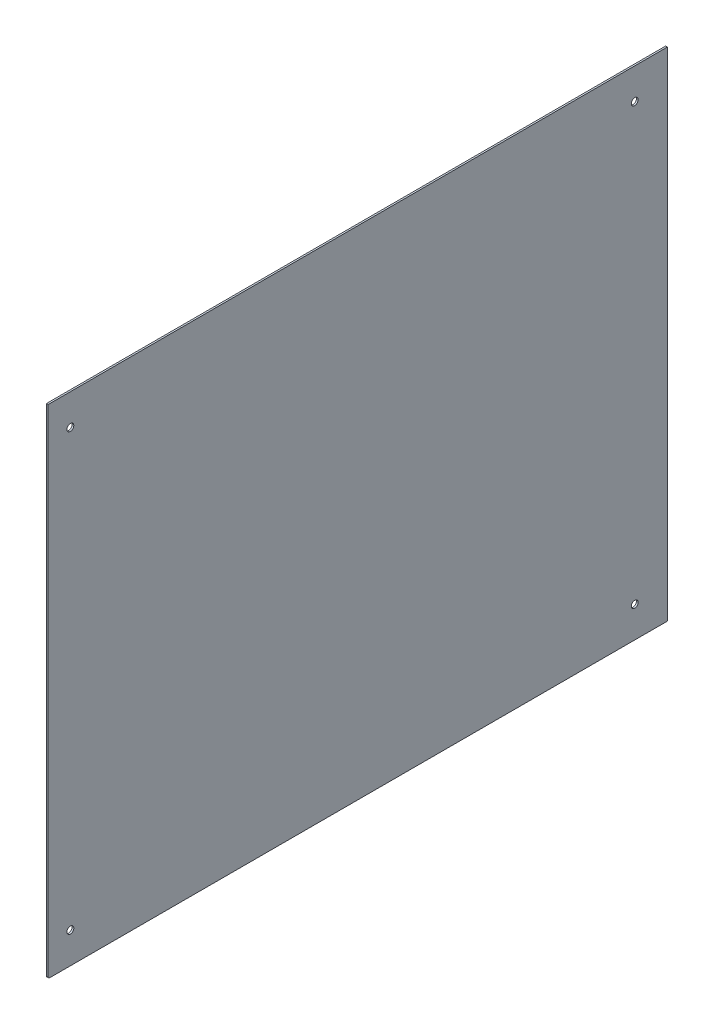
ISO-10303-21;
HEADER;
FILE_DESCRIPTION(('STEP AP214'),'2;1');
FILE_NAME('part.step','',(''),(''),'','','');
FILE_SCHEMA(('AUTOMOTIVE_DESIGN { 1 0 10303 214 1 1 1 1 }'));
ENDSEC;
DATA;
#1=APPLICATION_CONTEXT('core data for automotive mechanical design processes');
#2=APPLICATION_PROTOCOL_DEFINITION('international standard','automotive_design',2000,#1);
#3=PRODUCT_CONTEXT('',#1,'mechanical');
#4=PRODUCT('Part','Part','',(#3));
#5=PRODUCT_RELATED_PRODUCT_CATEGORY('part','',(#4));
#6=PRODUCT_DEFINITION_FORMATION('','',#4);
#7=PRODUCT_DEFINITION_CONTEXT('part definition',#1,'design');
#8=PRODUCT_DEFINITION('design','',#6,#7);
#9=PRODUCT_DEFINITION_SHAPE('','',#8);
#10=(LENGTH_UNIT() NAMED_UNIT(*) SI_UNIT(.MILLI.,.METRE.));
#11=(NAMED_UNIT(*) PLANE_ANGLE_UNIT() SI_UNIT($,.RADIAN.));
#12=(NAMED_UNIT(*) SI_UNIT($,.STERADIAN.) SOLID_ANGLE_UNIT());
#13=UNCERTAINTY_MEASURE_WITH_UNIT(LENGTH_MEASURE(1.E-05),#10,'distance_accuracy_value','');
#14=(GEOMETRIC_REPRESENTATION_CONTEXT(3) GLOBAL_UNCERTAINTY_ASSIGNED_CONTEXT((#13)) GLOBAL_UNIT_ASSIGNED_CONTEXT((#10,
#11,#12)) REPRESENTATION_CONTEXT('',''));
#15=CARTESIAN_POINT('',(0.,0.,0.));
#16=DIRECTION('',(0.,0.,1.));
#17=DIRECTION('',(1.,0.,0.));
#18=AXIS2_PLACEMENT_3D('',#15,#16,#17);
#19=CARTESIAN_POINT('',(1.,0.,0.));
#20=DIRECTION('',(1.,0.,0.));
#21=DIRECTION('',(0.,0.,-1.));
#22=AXIS2_PLACEMENT_3D('',#19,#20,#21);
#23=PLANE('',#22);
#24=CARTESIAN_POINT('',(1.,123.5,-161.));
#25=DIRECTION('',(1.,0.,0.));
#26=DIRECTION('',(0.,0.,1.));
#27=AXIS2_PLACEMENT_3D('',#24,#25,#26);
#28=CIRCLE('',#27,2.00000000000011);
#29=CARTESIAN_POINT('',(1.,123.5,-159.));
#30=VERTEX_POINT('',#29);
#31=EDGE_CURVE('E127',#30,#30,#28,.T.);
#32=ORIENTED_EDGE('',*,*,#31,.F.);
#33=EDGE_LOOP('',(#32));
#34=FACE_BOUND('',#33,.T.);
#35=CARTESIAN_POINT('',(1.,123.5,167.));
#36=DIRECTION('',(1.,0.,0.));
#37=DIRECTION('',(0.,0.,-1.));
#38=AXIS2_PLACEMENT_3D('',#35,#36,#37);
#39=CIRCLE('',#38,2.00000000000011);
#40=CARTESIAN_POINT('',(1.,123.5,165.));
#41=VERTEX_POINT('',#40);
#42=EDGE_CURVE('E139',#41,#41,#39,.T.);
#43=ORIENTED_EDGE('',*,*,#42,.F.);
#44=EDGE_LOOP('',(#43));
#45=FACE_BOUND('',#44,.T.);
#46=DIRECTION('',(0.,-1.,0.));
#47=VECTOR('',#46,1.);
#48=CARTESIAN_POINT('',(1.,-141.5,180.));
#49=LINE('',#48,#47);
#50=CARTESIAN_POINT('',(1.,141.5,180.));
#51=VERTEX_POINT('',#50);
#52=CARTESIAN_POINT('',(1.,-146.5,180.));
#53=VERTEX_POINT('',#52);
#54=EDGE_CURVE('E145',#51,#53,#49,.T.);
#55=ORIENTED_EDGE('',*,*,#54,.T.);
#56=CARTESIAN_POINT('',(1.,-146.5,179.));
#57=DIRECTION('',(1.,0.,0.));
#58=DIRECTION('',(0.,0.,-1.));
#59=AXIS2_PLACEMENT_3D('',#56,#57,#58);
#60=CIRCLE('',#59,1.);
#61=CARTESIAN_POINT('',(1.,-147.5,179.));
#62=VERTEX_POINT('',#61);
#63=EDGE_CURVE('E59',#53,#62,#60,.T.);
#64=ORIENTED_EDGE('',*,*,#63,.T.);
#65=DIRECTION('',(0.,0.,-1.));
#66=VECTOR('',#65,1.);
#67=CARTESIAN_POINT('',(1.,-147.5,180.));
#68=LINE('',#67,#66);
#69=CARTESIAN_POINT('',(1.,-147.5,-180.19683279803));
#70=VERTEX_POINT('',#69);
#71=EDGE_CURVE('E93',#62,#70,#68,.T.);
#72=ORIENTED_EDGE('',*,*,#71,.T.);
#73=DIRECTION('',(0.,1.,0.));
#74=VECTOR('',#73,1.);
#75=CARTESIAN_POINT('',(1.,-141.5,-180.19683279803));
#76=LINE('',#75,#74);
#77=CARTESIAN_POINT('',(1.,-141.5,-180.19683279803));
#78=VERTEX_POINT('',#77);
#79=EDGE_CURVE('E98',#70,#78,#76,.T.);
#80=ORIENTED_EDGE('',*,*,#79,.T.);
#81=DIRECTION('',(0.,0.,1.));
#82=VECTOR('',#81,1.);
#83=CARTESIAN_POINT('',(1.,-141.5,180.));
#84=LINE('',#83,#82);
#85=CARTESIAN_POINT('',(1.,-141.5,-180.));
#86=VERTEX_POINT('',#85);
#87=EDGE_CURVE('E108',#78,#86,#84,.T.);
#88=ORIENTED_EDGE('',*,*,#87,.T.);
#89=DIRECTION('',(0.,1.,0.));
#90=VECTOR('',#89,1.);
#91=CARTESIAN_POINT('',(1.,-141.5,-180.));
#92=LINE('',#91,#90);
#93=CARTESIAN_POINT('',(1.,141.5,-180.));
#94=VERTEX_POINT('',#93);
#95=EDGE_CURVE('E147',#86,#94,#92,.T.);
#96=ORIENTED_EDGE('',*,*,#95,.T.);
#97=DIRECTION('',(0.,0.,1.));
#98=VECTOR('',#97,1.);
#99=CARTESIAN_POINT('',(1.,141.5,-180.));
#100=LINE('',#99,#98);
#101=EDGE_CURVE('E150',#94,#51,#100,.T.);
#102=ORIENTED_EDGE('',*,*,#101,.T.);
#103=EDGE_LOOP('',(#55,#64,#72,#80,#88,#96,#102));
#104=FACE_BOUND('',#103,.T.);
#105=CARTESIAN_POINT('',(1.,-129.5,167.));
#106=DIRECTION('',(1.,0.,0.));
#107=DIRECTION('',(0.,0.,-1.));
#108=AXIS2_PLACEMENT_3D('',#105,#106,#107);
#109=CIRCLE('',#108,2.00000000000011);
#110=CARTESIAN_POINT('',(1.,-129.5,165.));
#111=VERTEX_POINT('',#110);
#112=EDGE_CURVE('E133',#111,#111,#109,.T.);
#113=ORIENTED_EDGE('',*,*,#112,.F.);
#114=EDGE_LOOP('',(#113));
#115=FACE_BOUND('',#114,.T.);
#116=CARTESIAN_POINT('',(1.,-129.5,-161.));
#117=DIRECTION('',(1.,0.,0.));
#118=DIRECTION('',(0.,0.,1.));
#119=AXIS2_PLACEMENT_3D('',#116,#117,#118);
#120=CIRCLE('',#119,2.00000000000011);
#121=CARTESIAN_POINT('',(1.,-129.5,-159.));
#122=VERTEX_POINT('',#121);
#123=EDGE_CURVE('E121',#122,#122,#120,.T.);
#124=ORIENTED_EDGE('',*,*,#123,.F.);
#125=EDGE_LOOP('',(#124));
#126=FACE_BOUND('',#125,.T.);
#127=ADVANCED_FACE('F37',(#34,#45,#104,#115,#126),#23,.T.);
#128=CARTESIAN_POINT('',(0.,0.,0.));
#129=DIRECTION('',(1.,0.,0.));
#130=DIRECTION('',(0.,0.,-1.));
#131=AXIS2_PLACEMENT_3D('',#128,#129,#130);
#132=PLANE('',#131);
#133=DIRECTION('',(0.,0.,1.));
#134=VECTOR('',#133,1.);
#135=CARTESIAN_POINT('',(0.,-147.5,180.));
#136=LINE('',#135,#134);
#137=CARTESIAN_POINT('',(0.,-147.5,-180.19683279803));
#138=VERTEX_POINT('',#137);
#139=CARTESIAN_POINT('',(0.,-147.5,179.));
#140=VERTEX_POINT('',#139);
#141=EDGE_CURVE('E104',#138,#140,#136,.T.);
#142=ORIENTED_EDGE('',*,*,#141,.T.);
#143=CARTESIAN_POINT('',(0.,-146.5,179.));
#144=DIRECTION('',(1.,0.,0.));
#145=DIRECTION('',(0.,0.,-1.));
#146=AXIS2_PLACEMENT_3D('',#143,#144,#145);
#147=CIRCLE('',#146,1.);
#148=CARTESIAN_POINT('',(0.,-146.5,180.));
#149=VERTEX_POINT('',#148);
#150=EDGE_CURVE('E11',#140,#149,#147,.F.);
#151=ORIENTED_EDGE('',*,*,#150,.T.);
#152=DIRECTION('',(0.,-1.,0.));
#153=VECTOR('',#152,1.);
#154=CARTESIAN_POINT('',(0.,-141.5,180.));
#155=LINE('',#154,#153);
#156=CARTESIAN_POINT('',(0.,141.5,180.));
#157=VERTEX_POINT('',#156);
#158=EDGE_CURVE('E142',#157,#149,#155,.T.);
#159=ORIENTED_EDGE('',*,*,#158,.F.);
#160=DIRECTION('',(0.,0.,1.));
#161=VECTOR('',#160,1.);
#162=CARTESIAN_POINT('',(0.,141.5,-180.));
#163=LINE('',#162,#161);
#164=CARTESIAN_POINT('',(0.,141.5,-180.));
#165=VERTEX_POINT('',#164);
#166=EDGE_CURVE('E148',#165,#157,#163,.T.);
#167=ORIENTED_EDGE('',*,*,#166,.F.);
#168=DIRECTION('',(0.,1.,0.));
#169=VECTOR('',#168,1.);
#170=CARTESIAN_POINT('',(0.,-141.5,-180.));
#171=LINE('',#170,#169);
#172=CARTESIAN_POINT('',(0.,-141.5,-180.));
#173=VERTEX_POINT('',#172);
#174=EDGE_CURVE('E155',#173,#165,#171,.T.);
#175=ORIENTED_EDGE('',*,*,#174,.F.);
#176=DIRECTION('',(0.,0.,-1.));
#177=VECTOR('',#176,1.);
#178=CARTESIAN_POINT('',(0.,-141.5,180.));
#179=LINE('',#178,#177);
#180=CARTESIAN_POINT('',(0.,-141.5,-180.19683279803));
#181=VERTEX_POINT('',#180);
#182=EDGE_CURVE('E120',#173,#181,#179,.T.);
#183=ORIENTED_EDGE('',*,*,#182,.T.);
#184=DIRECTION('',(0.,-1.,0.));
#185=VECTOR('',#184,1.);
#186=CARTESIAN_POINT('',(0.,-141.5,-180.19683279803));
#187=LINE('',#186,#185);
#188=EDGE_CURVE('E116',#181,#138,#187,.T.);
#189=ORIENTED_EDGE('',*,*,#188,.T.);
#190=EDGE_LOOP('',(#142,#151,#159,#167,#175,#183,#189));
#191=FACE_BOUND('',#190,.T.);
#192=CARTESIAN_POINT('',(0.,123.5,167.));
#193=DIRECTION('',(1.,0.,0.));
#194=DIRECTION('',(0.,0.,-1.));
#195=AXIS2_PLACEMENT_3D('',#192,#193,#194);
#196=CIRCLE('',#195,2.00000000000011);
#197=CARTESIAN_POINT('',(0.,123.5,165.));
#198=VERTEX_POINT('',#197);
#199=EDGE_CURVE('E136',#198,#198,#196,.T.);
#200=ORIENTED_EDGE('',*,*,#199,.T.);
#201=EDGE_LOOP('',(#200));
#202=FACE_BOUND('',#201,.T.);
#203=CARTESIAN_POINT('',(0.,-129.5,167.));
#204=DIRECTION('',(1.,0.,0.));
#205=DIRECTION('',(0.,0.,-1.));
#206=AXIS2_PLACEMENT_3D('',#203,#204,#205);
#207=CIRCLE('',#206,2.00000000000011);
#208=CARTESIAN_POINT('',(0.,-129.5,165.));
#209=VERTEX_POINT('',#208);
#210=EDGE_CURVE('E130',#209,#209,#207,.T.);
#211=ORIENTED_EDGE('',*,*,#210,.T.);
#212=EDGE_LOOP('',(#211));
#213=FACE_BOUND('',#212,.T.);
#214=CARTESIAN_POINT('',(0.,123.5,-161.));
#215=DIRECTION('',(1.,0.,0.));
#216=DIRECTION('',(0.,0.,1.));
#217=AXIS2_PLACEMENT_3D('',#214,#215,#216);
#218=CIRCLE('',#217,2.00000000000011);
#219=CARTESIAN_POINT('',(0.,123.5,-159.));
#220=VERTEX_POINT('',#219);
#221=EDGE_CURVE('E124',#220,#220,#218,.T.);
#222=ORIENTED_EDGE('',*,*,#221,.T.);
#223=EDGE_LOOP('',(#222));
#224=FACE_BOUND('',#223,.T.);
#225=CARTESIAN_POINT('',(0.,-129.5,-161.));
#226=DIRECTION('',(1.,0.,0.));
#227=DIRECTION('',(0.,0.,1.));
#228=AXIS2_PLACEMENT_3D('',#225,#226,#227);
#229=CIRCLE('',#228,2.00000000000011);
#230=CARTESIAN_POINT('',(0.,-129.5,-159.));
#231=VERTEX_POINT('',#230);
#232=EDGE_CURVE('E119',#231,#231,#229,.T.);
#233=ORIENTED_EDGE('',*,*,#232,.T.);
#234=EDGE_LOOP('',(#233));
#235=FACE_BOUND('',#234,.T.);
#236=ADVANCED_FACE('F184',(#191,#202,#213,#224,#235),#132,.F.);
#237=CARTESIAN_POINT('',(1.,-141.5,180.));
#238=DIRECTION('',(0.,0.,-1.));
#239=DIRECTION('',(-1.,0.,0.));
#240=AXIS2_PLACEMENT_3D('',#237,#238,#239);
#241=PLANE('',#240);
#242=ORIENTED_EDGE('',*,*,#158,.T.);
#243=DIRECTION('',(1.,0.,0.));
#244=VECTOR('',#243,1.);
#245=CARTESIAN_POINT('',(1.,-146.5,180.));
#246=LINE('',#245,#244);
#247=EDGE_CURVE('E166',#149,#53,#246,.T.);
#248=ORIENTED_EDGE('',*,*,#247,.T.);
#249=ORIENTED_EDGE('',*,*,#54,.F.);
#250=DIRECTION('',(-1.,0.,0.));
#251=VECTOR('',#250,1.);
#252=CARTESIAN_POINT('',(1.,141.5,180.));
#253=LINE('',#252,#251);
#254=EDGE_CURVE('E152',#51,#157,#253,.T.);
#255=ORIENTED_EDGE('',*,*,#254,.T.);
#256=EDGE_LOOP('',(#242,#248,#249,#255));
#257=FACE_BOUND('',#256,.T.);
#258=ADVANCED_FACE('F172',(#257),#241,.F.);
#259=CARTESIAN_POINT('',(1.,-141.5,-180.));
#260=DIRECTION('',(0.,0.,1.));
#261=DIRECTION('',(1.,0.,0.));
#262=AXIS2_PLACEMENT_3D('',#259,#260,#261);
#263=PLANE('',#262);
#264=ORIENTED_EDGE('',*,*,#174,.T.);
#265=DIRECTION('',(-1.,0.,0.));
#266=VECTOR('',#265,1.);
#267=CARTESIAN_POINT('',(1.,141.5,-180.));
#268=LINE('',#267,#266);
#269=EDGE_CURVE('E160',#94,#165,#268,.T.);
#270=ORIENTED_EDGE('',*,*,#269,.F.);
#271=ORIENTED_EDGE('',*,*,#95,.F.);
#272=DIRECTION('',(-1.,0.,0.));
#273=VECTOR('',#272,1.);
#274=CARTESIAN_POINT('',(1.,-141.5,-180.));
#275=LINE('',#274,#273);
#276=EDGE_CURVE('E163',#86,#173,#275,.T.);
#277=ORIENTED_EDGE('',*,*,#276,.T.);
#278=EDGE_LOOP('',(#264,#270,#271,#277));
#279=FACE_BOUND('',#278,.T.);
#280=ADVANCED_FACE('F207',(#279),#263,.F.);
#281=CARTESIAN_POINT('',(1.,141.5,-180.));
#282=DIRECTION('',(0.,-1.,0.));
#283=DIRECTION('',(0.,0.,-1.));
#284=AXIS2_PLACEMENT_3D('',#281,#282,#283);
#285=PLANE('',#284);
#286=ORIENTED_EDGE('',*,*,#166,.T.);
#287=ORIENTED_EDGE('',*,*,#254,.F.);
#288=ORIENTED_EDGE('',*,*,#101,.F.);
#289=ORIENTED_EDGE('',*,*,#269,.T.);
#290=EDGE_LOOP('',(#286,#287,#288,#289));
#291=FACE_BOUND('',#290,.T.);
#292=ADVANCED_FACE('F181',(#291),#285,.F.);
#293=CARTESIAN_POINT('',(1.,123.5,167.));
#294=DIRECTION('',(-1.,0.,0.));
#295=DIRECTION('',(0.,0.,1.));
#296=AXIS2_PLACEMENT_3D('',#293,#294,#295);
#297=CYLINDRICAL_SURFACE('',#296,2.00000000000011);
#298=ORIENTED_EDGE('',*,*,#42,.T.);
#299=EDGE_LOOP('',(#298));
#300=FACE_BOUND('',#299,.T.);
#301=ORIENTED_EDGE('',*,*,#199,.F.);
#302=EDGE_LOOP('',(#301));
#303=FACE_BOUND('',#302,.T.);
#304=ADVANCED_FACE('F202',(#300,#303),#297,.F.);
#305=CARTESIAN_POINT('',(1.,-129.5,167.));
#306=DIRECTION('',(-1.,0.,0.));
#307=DIRECTION('',(0.,0.,1.));
#308=AXIS2_PLACEMENT_3D('',#305,#306,#307);
#309=CYLINDRICAL_SURFACE('',#308,2.00000000000011);
#310=ORIENTED_EDGE('',*,*,#112,.T.);
#311=EDGE_LOOP('',(#310));
#312=FACE_BOUND('',#311,.T.);
#313=ORIENTED_EDGE('',*,*,#210,.F.);
#314=EDGE_LOOP('',(#313));
#315=FACE_BOUND('',#314,.T.);
#316=ADVANCED_FACE('F232',(#312,#315),#309,.F.);
#317=CARTESIAN_POINT('',(1.,123.5,-161.));
#318=DIRECTION('',(-1.,0.,0.));
#319=DIRECTION('',(0.,0.,1.));
#320=AXIS2_PLACEMENT_3D('',#317,#318,#319);
#321=CYLINDRICAL_SURFACE('',#320,2.00000000000011);
#322=ORIENTED_EDGE('',*,*,#31,.T.);
#323=EDGE_LOOP('',(#322));
#324=FACE_BOUND('',#323,.T.);
#325=ORIENTED_EDGE('',*,*,#221,.F.);
#326=EDGE_LOOP('',(#325));
#327=FACE_BOUND('',#326,.T.);
#328=ADVANCED_FACE('F239',(#324,#327),#321,.F.);
#329=CARTESIAN_POINT('',(1.,-129.5,-161.));
#330=DIRECTION('',(-1.,0.,0.));
#331=DIRECTION('',(0.,0.,1.));
#332=AXIS2_PLACEMENT_3D('',#329,#330,#331);
#333=CYLINDRICAL_SURFACE('',#332,2.00000000000011);
#334=ORIENTED_EDGE('',*,*,#123,.T.);
#335=EDGE_LOOP('',(#334));
#336=FACE_BOUND('',#335,.T.);
#337=ORIENTED_EDGE('',*,*,#232,.F.);
#338=EDGE_LOOP('',(#337));
#339=FACE_BOUND('',#338,.T.);
#340=ADVANCED_FACE('F246',(#336,#339),#333,.F.);
#341=CARTESIAN_POINT('',(-360.246802009028,-141.5,180.));
#342=DIRECTION('',(0.,1.,0.));
#343=DIRECTION('',(0.,0.,1.));
#344=AXIS2_PLACEMENT_3D('',#341,#342,#343);
#345=PLANE('',#344);
#346=ORIENTED_EDGE('',*,*,#276,.F.);
#347=ORIENTED_EDGE('',*,*,#87,.F.);
#348=DIRECTION('',(1.,0.,0.));
#349=VECTOR('',#348,1.);
#350=CARTESIAN_POINT('',(-360.246802009028,-141.5,-180.19683279803));
#351=LINE('',#350,#349);
#352=EDGE_CURVE('E107',#181,#78,#351,.T.);
#353=ORIENTED_EDGE('',*,*,#352,.F.);
#354=ORIENTED_EDGE('',*,*,#182,.F.);
#355=EDGE_LOOP('',(#346,#347,#353,#354));
#356=FACE_BOUND('',#355,.T.);
#357=ADVANCED_FACE('F253',(#356),#345,.T.);
#358=CARTESIAN_POINT('',(-360.246802009028,-141.5,-180.19683279803));
#359=DIRECTION('',(0.,0.,-1.));
#360=DIRECTION('',(-1.,0.,0.));
#361=AXIS2_PLACEMENT_3D('',#358,#359,#360);
#362=PLANE('',#361);
#363=ORIENTED_EDGE('',*,*,#188,.F.);
#364=ORIENTED_EDGE('',*,*,#352,.T.);
#365=ORIENTED_EDGE('',*,*,#79,.F.);
#366=DIRECTION('',(1.,0.,0.));
#367=VECTOR('',#366,1.);
#368=CARTESIAN_POINT('',(-360.246802009028,-147.5,-180.19683279803));
#369=LINE('',#368,#367);
#370=EDGE_CURVE('E102',#138,#70,#369,.T.);
#371=ORIENTED_EDGE('',*,*,#370,.F.);
#372=EDGE_LOOP('',(#363,#364,#365,#371));
#373=FACE_BOUND('',#372,.T.);
#374=ADVANCED_FACE('F110',(#373),#362,.T.);
#375=CARTESIAN_POINT('',(-360.246802009028,-147.5,180.));
#376=DIRECTION('',(0.,-1.,0.));
#377=DIRECTION('',(0.,0.,-1.));
#378=AXIS2_PLACEMENT_3D('',#375,#376,#377);
#379=PLANE('',#378);
#380=ORIENTED_EDGE('',*,*,#71,.F.);
#381=DIRECTION('',(1.,0.,0.));
#382=VECTOR('',#381,1.);
#383=CARTESIAN_POINT('',(0.,-147.5,179.));
#384=LINE('',#383,#382);
#385=EDGE_CURVE('E45',#62,#140,#384,.F.);
#386=ORIENTED_EDGE('',*,*,#385,.T.);
#387=ORIENTED_EDGE('',*,*,#141,.F.);
#388=ORIENTED_EDGE('',*,*,#370,.T.);
#389=EDGE_LOOP('',(#380,#386,#387,#388));
#390=FACE_BOUND('',#389,.T.);
#391=ADVANCED_FACE('F103',(#390),#379,.T.);
#392=CARTESIAN_POINT('',(1.,-146.5,179.));
#393=DIRECTION('',(-1.,0.,0.));
#394=DIRECTION('',(0.,0.,1.));
#395=AXIS2_PLACEMENT_3D('',#392,#393,#394);
#396=CYLINDRICAL_SURFACE('',#395,1.);
#397=ORIENTED_EDGE('',*,*,#150,.F.);
#398=ORIENTED_EDGE('',*,*,#385,.F.);
#399=ORIENTED_EDGE('',*,*,#63,.F.);
#400=ORIENTED_EDGE('',*,*,#247,.F.);
#401=EDGE_LOOP('',(#397,#398,#399,#400));
#402=FACE_BOUND('',#401,.T.);
#403=ADVANCED_FACE('F39',(#402),#396,.T.);
#404=CLOSED_SHELL('',(#127,#236,#258,#280,#292,#304,#316,#328,#340,#357,#374,#391,#403));
#405=MANIFOLD_SOLID_BREP('B2',#404);
#406=ADVANCED_BREP_SHAPE_REPRESENTATION('',(#18,#405),#14);
#407=SHAPE_DEFINITION_REPRESENTATION(#9,#406);
ENDSEC;
END-ISO-10303-21;
